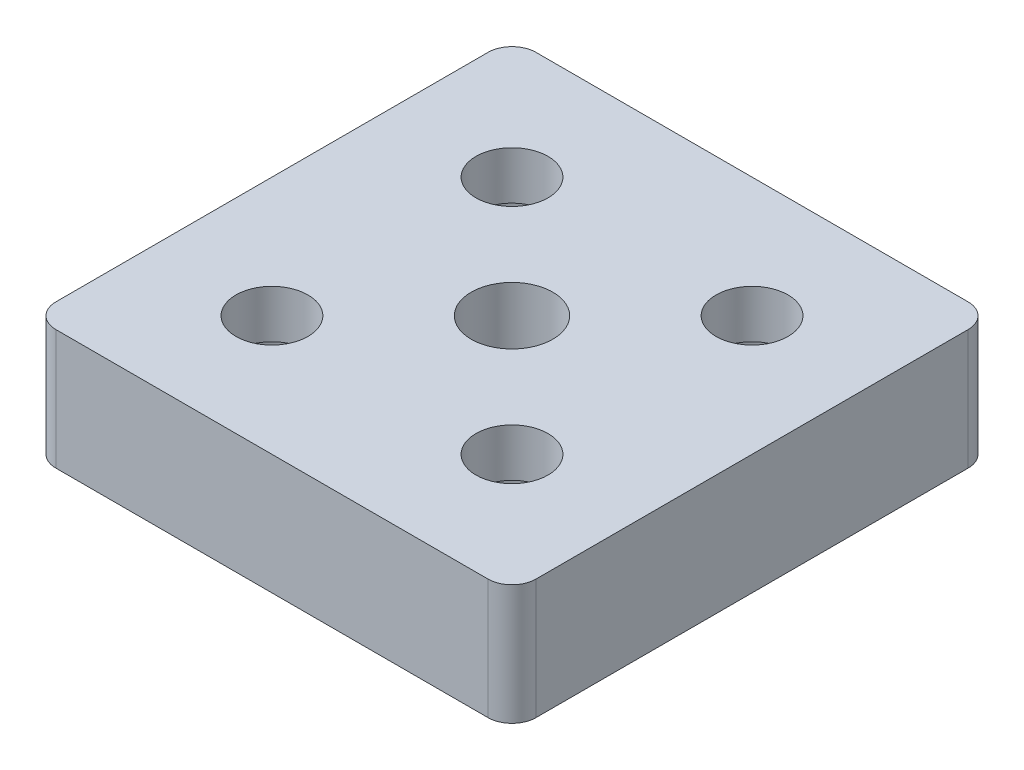
ISO-10303-21;
HEADER;
FILE_DESCRIPTION(('STEP AP214'),'2;1');
FILE_NAME('part.step','',(''),(''),'','','');
FILE_SCHEMA(('AUTOMOTIVE_DESIGN { 1 0 10303 214 1 1 1 1 }'));
ENDSEC;
DATA;
#1=APPLICATION_CONTEXT('core data for automotive mechanical design processes');
#2=APPLICATION_PROTOCOL_DEFINITION('international standard','automotive_design',2000,#1);
#3=PRODUCT_CONTEXT('',#1,'mechanical');
#4=PRODUCT('Part','Part','',(#3));
#5=PRODUCT_RELATED_PRODUCT_CATEGORY('part','',(#4));
#6=PRODUCT_DEFINITION_FORMATION('','',#4);
#7=PRODUCT_DEFINITION_CONTEXT('part definition',#1,'design');
#8=PRODUCT_DEFINITION('design','',#6,#7);
#9=PRODUCT_DEFINITION_SHAPE('','',#8);
#10=(LENGTH_UNIT() NAMED_UNIT(*) SI_UNIT(.MILLI.,.METRE.));
#11=(NAMED_UNIT(*) PLANE_ANGLE_UNIT() SI_UNIT($,.RADIAN.));
#12=(NAMED_UNIT(*) SI_UNIT($,.STERADIAN.) SOLID_ANGLE_UNIT());
#13=UNCERTAINTY_MEASURE_WITH_UNIT(LENGTH_MEASURE(1.E-05),#10,'distance_accuracy_value','');
#14=(GEOMETRIC_REPRESENTATION_CONTEXT(3) GLOBAL_UNCERTAINTY_ASSIGNED_CONTEXT((#13)) GLOBAL_UNIT_ASSIGNED_CONTEXT((#10,
#11,#12)) REPRESENTATION_CONTEXT('',''));
#15=CARTESIAN_POINT('',(0.,0.,0.));
#16=DIRECTION('',(0.,0.,1.));
#17=DIRECTION('',(1.,0.,0.));
#18=AXIS2_PLACEMENT_3D('',#15,#16,#17);
#19=CARTESIAN_POINT('',(10.,10.,-30.));
#20=DIRECTION('',(0.,-1.,0.));
#21=DIRECTION('',(0.,0.,-1.));
#22=AXIS2_PLACEMENT_3D('',#19,#20,#21);
#23=CYLINDRICAL_SURFACE('',#22,3.);
#24=CARTESIAN_POINT('',(10.,10.,-30.));
#25=DIRECTION('',(0.,1.,0.));
#26=DIRECTION('',(0.,0.,1.));
#27=AXIS2_PLACEMENT_3D('',#24,#25,#26);
#28=CIRCLE('',#27,3.);
#29=CARTESIAN_POINT('',(10.,10.,-27.));
#30=VERTEX_POINT('',#29);
#31=EDGE_CURVE('E141',#30,#30,#28,.T.);
#32=ORIENTED_EDGE('',*,*,#31,.T.);
#33=EDGE_LOOP('',(#32));
#34=FACE_BOUND('',#33,.T.);
#35=CARTESIAN_POINT('',(10.,6.,-30.));
#36=DIRECTION('',(0.,-1.,0.));
#37=DIRECTION('',(0.,0.,-1.));
#38=AXIS2_PLACEMENT_3D('',#35,#36,#37);
#39=CIRCLE('',#38,3.);
#40=CARTESIAN_POINT('',(10.,6.,-33.));
#41=VERTEX_POINT('',#40);
#42=EDGE_CURVE('E41',#41,#41,#39,.T.);
#43=ORIENTED_EDGE('',*,*,#42,.T.);
#44=EDGE_LOOP('',(#43));
#45=FACE_BOUND('',#44,.T.);
#46=ADVANCED_FACE('F37',(#34,#45),#23,.F.);
#47=CARTESIAN_POINT('',(-10.,10.,-30.));
#48=DIRECTION('',(0.,-1.,0.));
#49=DIRECTION('',(0.,0.,-1.));
#50=AXIS2_PLACEMENT_3D('',#47,#48,#49);
#51=CYLINDRICAL_SURFACE('',#50,3.);
#52=CARTESIAN_POINT('',(-10.,10.,-30.));
#53=DIRECTION('',(0.,1.,0.));
#54=DIRECTION('',(0.,0.,1.));
#55=AXIS2_PLACEMENT_3D('',#52,#53,#54);
#56=CIRCLE('',#55,3.);
#57=CARTESIAN_POINT('',(-10.,10.,-27.));
#58=VERTEX_POINT('',#57);
#59=EDGE_CURVE('E203',#58,#58,#56,.T.);
#60=ORIENTED_EDGE('',*,*,#59,.T.);
#61=EDGE_LOOP('',(#60));
#62=FACE_BOUND('',#61,.T.);
#63=CARTESIAN_POINT('',(-10.,6.,-30.));
#64=DIRECTION('',(0.,-1.,0.));
#65=DIRECTION('',(0.,0.,-1.));
#66=AXIS2_PLACEMENT_3D('',#63,#64,#65);
#67=CIRCLE('',#66,3.);
#68=CARTESIAN_POINT('',(-10.,6.,-33.));
#69=VERTEX_POINT('',#68);
#70=EDGE_CURVE('E173',#69,#69,#67,.T.);
#71=ORIENTED_EDGE('',*,*,#70,.T.);
#72=EDGE_LOOP('',(#71));
#73=FACE_BOUND('',#72,.T.);
#74=ADVANCED_FACE('F244',(#62,#73),#51,.F.);
#75=CARTESIAN_POINT('',(10.,10.,-9.99999999999977));
#76=DIRECTION('',(0.,-1.,0.));
#77=DIRECTION('',(0.,0.,-1.));
#78=AXIS2_PLACEMENT_3D('',#75,#76,#77);
#79=CYLINDRICAL_SURFACE('',#78,3.);
#80=CARTESIAN_POINT('',(10.,10.,-9.99999999999977));
#81=DIRECTION('',(0.,1.,0.));
#82=DIRECTION('',(0.,0.,1.));
#83=AXIS2_PLACEMENT_3D('',#80,#81,#82);
#84=CIRCLE('',#83,3.);
#85=CARTESIAN_POINT('',(10.,10.,-6.99999999999977));
#86=VERTEX_POINT('',#85);
#87=EDGE_CURVE('E167',#86,#86,#84,.T.);
#88=ORIENTED_EDGE('',*,*,#87,.T.);
#89=EDGE_LOOP('',(#88));
#90=FACE_BOUND('',#89,.T.);
#91=CARTESIAN_POINT('',(10.,6.,-9.99999999999977));
#92=DIRECTION('',(0.,-1.,0.));
#93=DIRECTION('',(0.,0.,-1.));
#94=AXIS2_PLACEMENT_3D('',#91,#92,#93);
#95=CIRCLE('',#94,3.);
#96=CARTESIAN_POINT('',(10.,6.,-12.9999999999998));
#97=VERTEX_POINT('',#96);
#98=EDGE_CURVE('E169',#97,#97,#95,.T.);
#99=ORIENTED_EDGE('',*,*,#98,.T.);
#100=EDGE_LOOP('',(#99));
#101=FACE_BOUND('',#100,.T.);
#102=ADVANCED_FACE('F250',(#90,#101),#79,.F.);
#103=CARTESIAN_POINT('',(-10.0000000000002,10.,-10.));
#104=DIRECTION('',(0.,-1.,0.));
#105=DIRECTION('',(0.,0.,-1.));
#106=AXIS2_PLACEMENT_3D('',#103,#104,#105);
#107=CYLINDRICAL_SURFACE('',#106,3.);
#108=CARTESIAN_POINT('',(-10.0000000000002,10.,-10.));
#109=DIRECTION('',(0.,1.,0.));
#110=DIRECTION('',(0.,0.,1.));
#111=AXIS2_PLACEMENT_3D('',#108,#109,#110);
#112=CIRCLE('',#111,3.);
#113=CARTESIAN_POINT('',(-10.0000000000002,10.,-7.));
#114=VERTEX_POINT('',#113);
#115=EDGE_CURVE('E200',#114,#114,#112,.T.);
#116=ORIENTED_EDGE('',*,*,#115,.T.);
#117=EDGE_LOOP('',(#116));
#118=FACE_BOUND('',#117,.T.);
#119=CARTESIAN_POINT('',(-10.0000000000002,6.,-10.));
#120=DIRECTION('',(0.,-1.,0.));
#121=DIRECTION('',(0.,0.,-1.));
#122=AXIS2_PLACEMENT_3D('',#119,#120,#121);
#123=CIRCLE('',#122,3.);
#124=CARTESIAN_POINT('',(-10.0000000000002,6.,-13.));
#125=VERTEX_POINT('',#124);
#126=EDGE_CURVE('E164',#125,#125,#123,.T.);
#127=ORIENTED_EDGE('',*,*,#126,.T.);
#128=EDGE_LOOP('',(#127));
#129=FACE_BOUND('',#128,.T.);
#130=ADVANCED_FACE('F257',(#118,#129),#107,.F.);
#131=CARTESIAN_POINT('',(-18.,10.,-2.));
#132=DIRECTION('',(0.,1.,0.));
#133=DIRECTION('',(0.,0.,1.));
#134=AXIS2_PLACEMENT_3D('',#131,#132,#133);
#135=PLANE('',#134);
#136=CARTESIAN_POINT('',(0.,10.,-20.));
#137=DIRECTION('',(0.,1.,0.));
#138=DIRECTION('',(0.,0.,1.));
#139=AXIS2_PLACEMENT_3D('',#136,#137,#138);
#140=CIRCLE('',#139,3.4);
#141=CARTESIAN_POINT('',(0.,10.,-16.6));
#142=VERTEX_POINT('',#141);
#143=EDGE_CURVE('E474',#142,#142,#140,.T.);
#144=ORIENTED_EDGE('',*,*,#143,.F.);
#145=EDGE_LOOP('',(#144));
#146=FACE_BOUND('',#145,.T.);
#147=ORIENTED_EDGE('',*,*,#115,.F.);
#148=EDGE_LOOP('',(#147));
#149=FACE_BOUND('',#148,.T.);
#150=ORIENTED_EDGE('',*,*,#31,.F.);
#151=EDGE_LOOP('',(#150));
#152=FACE_BOUND('',#151,.T.);
#153=CARTESIAN_POINT('',(-18.,10.,-2.));
#154=DIRECTION('',(0.,1.,0.));
#155=DIRECTION('',(0.,0.,1.));
#156=AXIS2_PLACEMENT_3D('',#153,#154,#155);
#157=CIRCLE('',#156,2.);
#158=CARTESIAN_POINT('',(-20.,10.,-2.));
#159=VERTEX_POINT('',#158);
#160=CARTESIAN_POINT('',(-18.,10.,0.));
#161=VERTEX_POINT('',#160);
#162=EDGE_CURVE('E152',#159,#161,#157,.T.);
#163=ORIENTED_EDGE('',*,*,#162,.T.);
#164=DIRECTION('',(1.,0.,0.));
#165=VECTOR('',#164,1.);
#166=CARTESIAN_POINT('',(-18.,10.,0.));
#167=LINE('',#166,#165);
#168=CARTESIAN_POINT('',(18.,10.,0.));
#169=VERTEX_POINT('',#168);
#170=EDGE_CURVE('E99',#161,#169,#167,.T.);
#171=ORIENTED_EDGE('',*,*,#170,.T.);
#172=CARTESIAN_POINT('',(18.,10.,-1.99999999999994));
#173=DIRECTION('',(0.,1.,0.));
#174=DIRECTION('',(0.,0.,1.));
#175=AXIS2_PLACEMENT_3D('',#172,#173,#174);
#176=CIRCLE('',#175,2.);
#177=CARTESIAN_POINT('',(20.,10.,-1.99999999999994));
#178=VERTEX_POINT('',#177);
#179=EDGE_CURVE('E210',#169,#178,#176,.T.);
#180=ORIENTED_EDGE('',*,*,#179,.T.);
#181=DIRECTION('',(0.,0.,-1.));
#182=VECTOR('',#181,1.);
#183=CARTESIAN_POINT('',(20.,10.,-1.99999999999994));
#184=LINE('',#183,#182);
#185=CARTESIAN_POINT('',(20.0000000000002,10.,-38.));
#186=VERTEX_POINT('',#185);
#187=EDGE_CURVE('E212',#178,#186,#184,.T.);
#188=ORIENTED_EDGE('',*,*,#187,.T.);
#189=CARTESIAN_POINT('',(18.0000000000002,10.,-38.));
#190=DIRECTION('',(0.,1.,0.));
#191=DIRECTION('',(0.,0.,1.));
#192=AXIS2_PLACEMENT_3D('',#189,#190,#191);
#193=CIRCLE('',#192,2.);
#194=CARTESIAN_POINT('',(18.0000000000002,10.,-40.));
#195=VERTEX_POINT('',#194);
#196=EDGE_CURVE('E119',#186,#195,#193,.T.);
#197=ORIENTED_EDGE('',*,*,#196,.T.);
#198=DIRECTION('',(-1.,0.,0.));
#199=VECTOR('',#198,1.);
#200=CARTESIAN_POINT('',(18.0000000000002,10.,-40.));
#201=LINE('',#200,#199);
#202=CARTESIAN_POINT('',(-18.,10.,-39.9999999999999));
#203=VERTEX_POINT('',#202);
#204=EDGE_CURVE('E112',#195,#203,#201,.T.);
#205=ORIENTED_EDGE('',*,*,#204,.T.);
#206=CARTESIAN_POINT('',(-18.,10.,-37.9999999999999));
#207=DIRECTION('',(0.,1.,0.));
#208=DIRECTION('',(0.,0.,1.));
#209=AXIS2_PLACEMENT_3D('',#206,#207,#208);
#210=CIRCLE('',#209,2.);
#211=CARTESIAN_POINT('',(-20.,10.,-37.9999999999999));
#212=VERTEX_POINT('',#211);
#213=EDGE_CURVE('E117',#203,#212,#210,.T.);
#214=ORIENTED_EDGE('',*,*,#213,.T.);
#215=DIRECTION('',(0.,0.,1.));
#216=VECTOR('',#215,1.);
#217=CARTESIAN_POINT('',(-20.,10.,-37.9999999999999));
#218=LINE('',#217,#216);
#219=EDGE_CURVE('E56',#212,#159,#218,.T.);
#220=ORIENTED_EDGE('',*,*,#219,.T.);
#221=EDGE_LOOP('',(#163,#171,#180,#188,#197,#205,#214,#220));
#222=FACE_BOUND('',#221,.T.);
#223=ORIENTED_EDGE('',*,*,#59,.F.);
#224=EDGE_LOOP('',(#223));
#225=FACE_BOUND('',#224,.T.);
#226=ORIENTED_EDGE('',*,*,#87,.F.);
#227=EDGE_LOOP('',(#226));
#228=FACE_BOUND('',#227,.T.);
#229=ADVANCED_FACE('F114',(#146,#149,#152,#222,#225,#228),#135,.T.);
#230=CARTESIAN_POINT('',(-18.,0.,-2.));
#231=DIRECTION('',(0.,1.,0.));
#232=DIRECTION('',(0.,0.,1.));
#233=AXIS2_PLACEMENT_3D('',#230,#231,#232);
#234=PLANE('',#233);
#235=CARTESIAN_POINT('',(0.,0.,-20.));
#236=DIRECTION('',(0.,1.,0.));
#237=DIRECTION('',(0.,0.,1.));
#238=AXIS2_PLACEMENT_3D('',#235,#236,#237);
#239=CIRCLE('',#238,3.39999999999999);
#240=CARTESIAN_POINT('',(0.,0.,-16.6));
#241=VERTEX_POINT('',#240);
#242=EDGE_CURVE('E268',#241,#241,#239,.T.);
#243=ORIENTED_EDGE('',*,*,#242,.T.);
#244=EDGE_LOOP('',(#243));
#245=FACE_BOUND('',#244,.T.);
#246=CARTESIAN_POINT('',(10.,0.,-30.));
#247=DIRECTION('',(0.,-1.,0.));
#248=DIRECTION('',(0.,0.,-1.));
#249=AXIS2_PLACEMENT_3D('',#246,#247,#248);
#250=CIRCLE('',#249,5.5);
#251=CARTESIAN_POINT('',(10.,0.,-35.5));
#252=VERTEX_POINT('',#251);
#253=EDGE_CURVE('E189',#252,#252,#250,.T.);
#254=ORIENTED_EDGE('',*,*,#253,.F.);
#255=EDGE_LOOP('',(#254));
#256=FACE_BOUND('',#255,.T.);
#257=CARTESIAN_POINT('',(-10.0000000000002,0.,-30.0000000000002));
#258=DIRECTION('',(0.,-1.,0.));
#259=DIRECTION('',(0.,0.,-1.));
#260=AXIS2_PLACEMENT_3D('',#257,#258,#259);
#261=CIRCLE('',#260,5.5);
#262=CARTESIAN_POINT('',(-10.0000000000002,0.,-35.5000000000002));
#263=VERTEX_POINT('',#262);
#264=EDGE_CURVE('E182',#263,#263,#261,.T.);
#265=ORIENTED_EDGE('',*,*,#264,.F.);
#266=EDGE_LOOP('',(#265));
#267=FACE_BOUND('',#266,.T.);
#268=CARTESIAN_POINT('',(10.,0.,-9.99999999999977));
#269=DIRECTION('',(0.,-1.,0.));
#270=DIRECTION('',(0.,0.,-1.));
#271=AXIS2_PLACEMENT_3D('',#268,#269,#270);
#272=CIRCLE('',#271,5.5);
#273=CARTESIAN_POINT('',(10.,0.,-15.4999999999998));
#274=VERTEX_POINT('',#273);
#275=EDGE_CURVE('E175',#274,#274,#272,.T.);
#276=ORIENTED_EDGE('',*,*,#275,.F.);
#277=EDGE_LOOP('',(#276));
#278=FACE_BOUND('',#277,.T.);
#279=CARTESIAN_POINT('',(-10.0000000000002,0.,-10.));
#280=DIRECTION('',(0.,-1.,0.));
#281=DIRECTION('',(0.,0.,-1.));
#282=AXIS2_PLACEMENT_3D('',#279,#280,#281);
#283=CIRCLE('',#282,5.5);
#284=CARTESIAN_POINT('',(-10.0000000000002,0.,-15.5));
#285=VERTEX_POINT('',#284);
#286=EDGE_CURVE('E171',#285,#285,#283,.T.);
#287=ORIENTED_EDGE('',*,*,#286,.F.);
#288=EDGE_LOOP('',(#287));
#289=FACE_BOUND('',#288,.T.);
#290=CARTESIAN_POINT('',(-18.,0.,-2.));
#291=DIRECTION('',(0.,1.,0.));
#292=DIRECTION('',(0.,0.,1.));
#293=AXIS2_PLACEMENT_3D('',#290,#291,#292);
#294=CIRCLE('',#293,2.);
#295=CARTESIAN_POINT('',(-20.,0.,-2.));
#296=VERTEX_POINT('',#295);
#297=CARTESIAN_POINT('',(-18.,0.,0.));
#298=VERTEX_POINT('',#297);
#299=EDGE_CURVE('E137',#296,#298,#294,.T.);
#300=ORIENTED_EDGE('',*,*,#299,.F.);
#301=DIRECTION('',(0.,0.,1.));
#302=VECTOR('',#301,1.);
#303=CARTESIAN_POINT('',(-20.,0.,-37.9999999999999));
#304=LINE('',#303,#302);
#305=CARTESIAN_POINT('',(-20.,0.,-37.9999999999999));
#306=VERTEX_POINT('',#305);
#307=EDGE_CURVE('E91',#306,#296,#304,.T.);
#308=ORIENTED_EDGE('',*,*,#307,.F.);
#309=CARTESIAN_POINT('',(-18.,0.,-37.9999999999999));
#310=DIRECTION('',(0.,1.,0.));
#311=DIRECTION('',(0.,0.,1.));
#312=AXIS2_PLACEMENT_3D('',#309,#310,#311);
#313=CIRCLE('',#312,2.);
#314=CARTESIAN_POINT('',(-18.,0.,-39.9999999999999));
#315=VERTEX_POINT('',#314);
#316=EDGE_CURVE('E85',#315,#306,#313,.T.);
#317=ORIENTED_EDGE('',*,*,#316,.F.);
#318=DIRECTION('',(-1.,0.,0.));
#319=VECTOR('',#318,1.);
#320=CARTESIAN_POINT('',(18.0000000000002,0.,-40.));
#321=LINE('',#320,#319);
#322=CARTESIAN_POINT('',(18.0000000000002,0.,-40.));
#323=VERTEX_POINT('',#322);
#324=EDGE_CURVE('E127',#323,#315,#321,.T.);
#325=ORIENTED_EDGE('',*,*,#324,.F.);
#326=CARTESIAN_POINT('',(18.0000000000002,0.,-38.));
#327=DIRECTION('',(0.,1.,0.));
#328=DIRECTION('',(0.,0.,1.));
#329=AXIS2_PLACEMENT_3D('',#326,#327,#328);
#330=CIRCLE('',#329,2.);
#331=CARTESIAN_POINT('',(20.0000000000002,0.,-38.));
#332=VERTEX_POINT('',#331);
#333=EDGE_CURVE('E147',#332,#323,#330,.T.);
#334=ORIENTED_EDGE('',*,*,#333,.F.);
#335=DIRECTION('',(0.,0.,-1.));
#336=VECTOR('',#335,1.);
#337=CARTESIAN_POINT('',(20.,0.,-1.99999999999994));
#338=LINE('',#337,#336);
#339=CARTESIAN_POINT('',(20.,0.,-1.99999999999994));
#340=VERTEX_POINT('',#339);
#341=EDGE_CURVE('E145',#340,#332,#338,.T.);
#342=ORIENTED_EDGE('',*,*,#341,.F.);
#343=CARTESIAN_POINT('',(18.,0.,-1.99999999999994));
#344=DIRECTION('',(0.,1.,0.));
#345=DIRECTION('',(0.,0.,1.));
#346=AXIS2_PLACEMENT_3D('',#343,#344,#345);
#347=CIRCLE('',#346,2.);
#348=CARTESIAN_POINT('',(18.,0.,0.));
#349=VERTEX_POINT('',#348);
#350=EDGE_CURVE('E143',#349,#340,#347,.T.);
#351=ORIENTED_EDGE('',*,*,#350,.F.);
#352=DIRECTION('',(1.,0.,0.));
#353=VECTOR('',#352,1.);
#354=CARTESIAN_POINT('',(-18.,0.,0.));
#355=LINE('',#354,#353);
#356=EDGE_CURVE('E140',#298,#349,#355,.T.);
#357=ORIENTED_EDGE('',*,*,#356,.F.);
#358=EDGE_LOOP('',(#300,#308,#317,#325,#334,#342,#351,#357));
#359=FACE_BOUND('',#358,.T.);
#360=ADVANCED_FACE('F225',(#245,#256,#267,#278,#289,#359),#234,.F.);
#361=CARTESIAN_POINT('',(-18.,10.,-2.));
#362=DIRECTION('',(0.,-1.,0.));
#363=DIRECTION('',(0.,0.,-1.));
#364=AXIS2_PLACEMENT_3D('',#361,#362,#363);
#365=CYLINDRICAL_SURFACE('',#364,2.);
#366=ORIENTED_EDGE('',*,*,#299,.T.);
#367=DIRECTION('',(0.,-1.,0.));
#368=VECTOR('',#367,1.);
#369=CARTESIAN_POINT('',(-18.,10.,0.));
#370=LINE('',#369,#368);
#371=EDGE_CURVE('E11',#161,#298,#370,.T.);
#372=ORIENTED_EDGE('',*,*,#371,.F.);
#373=ORIENTED_EDGE('',*,*,#162,.F.);
#374=DIRECTION('',(0.,-1.,0.));
#375=VECTOR('',#374,1.);
#376=CARTESIAN_POINT('',(-20.,10.,-2.));
#377=LINE('',#376,#375);
#378=EDGE_CURVE('E133',#159,#296,#377,.T.);
#379=ORIENTED_EDGE('',*,*,#378,.T.);
#380=EDGE_LOOP('',(#366,#372,#373,#379));
#381=FACE_BOUND('',#380,.T.);
#382=ADVANCED_FACE('F39',(#381),#365,.T.);
#383=CARTESIAN_POINT('',(-18.,10.,0.));
#384=DIRECTION('',(0.,0.,-1.));
#385=DIRECTION('',(-1.,0.,0.));
#386=AXIS2_PLACEMENT_3D('',#383,#384,#385);
#387=PLANE('',#386);
#388=ORIENTED_EDGE('',*,*,#356,.T.);
#389=DIRECTION('',(0.,-1.,0.));
#390=VECTOR('',#389,1.);
#391=CARTESIAN_POINT('',(18.,10.,0.));
#392=LINE('',#391,#390);
#393=EDGE_CURVE('E47',#169,#349,#392,.T.);
#394=ORIENTED_EDGE('',*,*,#393,.F.);
#395=ORIENTED_EDGE('',*,*,#170,.F.);
#396=ORIENTED_EDGE('',*,*,#371,.T.);
#397=EDGE_LOOP('',(#388,#394,#395,#396));
#398=FACE_BOUND('',#397,.T.);
#399=ADVANCED_FACE('F264',(#398),#387,.F.);
#400=CARTESIAN_POINT('',(18.,10.,-1.99999999999994));
#401=DIRECTION('',(0.,-1.,0.));
#402=DIRECTION('',(0.,0.,-1.));
#403=AXIS2_PLACEMENT_3D('',#400,#401,#402);
#404=CYLINDRICAL_SURFACE('',#403,2.);
#405=ORIENTED_EDGE('',*,*,#350,.T.);
#406=DIRECTION('',(0.,-1.,0.));
#407=VECTOR('',#406,1.);
#408=CARTESIAN_POINT('',(20.,10.,-1.99999999999994));
#409=LINE('',#408,#407);
#410=EDGE_CURVE('E159',#178,#340,#409,.T.);
#411=ORIENTED_EDGE('',*,*,#410,.F.);
#412=ORIENTED_EDGE('',*,*,#179,.F.);
#413=ORIENTED_EDGE('',*,*,#393,.T.);
#414=EDGE_LOOP('',(#405,#411,#412,#413));
#415=FACE_BOUND('',#414,.T.);
#416=ADVANCED_FACE('F433',(#415),#404,.T.);
#417=CARTESIAN_POINT('',(20.,10.,-1.99999999999994));
#418=DIRECTION('',(-1.,0.,0.));
#419=DIRECTION('',(0.,0.,1.));
#420=AXIS2_PLACEMENT_3D('',#417,#418,#419);
#421=PLANE('',#420);
#422=ORIENTED_EDGE('',*,*,#341,.T.);
#423=DIRECTION('',(0.,-1.,0.));
#424=VECTOR('',#423,1.);
#425=CARTESIAN_POINT('',(20.0000000000002,10.,-38.));
#426=LINE('',#425,#424);
#427=EDGE_CURVE('E156',#186,#332,#426,.T.);
#428=ORIENTED_EDGE('',*,*,#427,.F.);
#429=ORIENTED_EDGE('',*,*,#187,.F.);
#430=ORIENTED_EDGE('',*,*,#410,.T.);
#431=EDGE_LOOP('',(#422,#428,#429,#430));
#432=FACE_BOUND('',#431,.T.);
#433=ADVANCED_FACE('F218',(#432),#421,.F.);
#434=CARTESIAN_POINT('',(18.0000000000002,10.,-38.));
#435=DIRECTION('',(0.,-1.,0.));
#436=DIRECTION('',(0.,0.,-1.));
#437=AXIS2_PLACEMENT_3D('',#434,#435,#436);
#438=CYLINDRICAL_SURFACE('',#437,2.);
#439=ORIENTED_EDGE('',*,*,#333,.T.);
#440=DIRECTION('',(0.,-1.,0.));
#441=VECTOR('',#440,1.);
#442=CARTESIAN_POINT('',(18.0000000000002,10.,-40.));
#443=LINE('',#442,#441);
#444=EDGE_CURVE('E128',#195,#323,#443,.T.);
#445=ORIENTED_EDGE('',*,*,#444,.F.);
#446=ORIENTED_EDGE('',*,*,#196,.F.);
#447=ORIENTED_EDGE('',*,*,#427,.T.);
#448=EDGE_LOOP('',(#439,#445,#446,#447));
#449=FACE_BOUND('',#448,.T.);
#450=ADVANCED_FACE('F222',(#449),#438,.T.);
#451=CARTESIAN_POINT('',(18.0000000000002,10.,-40.));
#452=DIRECTION('',(0.,0.,1.));
#453=DIRECTION('',(1.,0.,0.));
#454=AXIS2_PLACEMENT_3D('',#451,#452,#453);
#455=PLANE('',#454);
#456=ORIENTED_EDGE('',*,*,#324,.T.);
#457=DIRECTION('',(0.,-1.,0.));
#458=VECTOR('',#457,1.);
#459=CARTESIAN_POINT('',(-18.,10.,-39.9999999999999));
#460=LINE('',#459,#458);
#461=EDGE_CURVE('E124',#203,#315,#460,.T.);
#462=ORIENTED_EDGE('',*,*,#461,.F.);
#463=ORIENTED_EDGE('',*,*,#204,.F.);
#464=ORIENTED_EDGE('',*,*,#444,.T.);
#465=EDGE_LOOP('',(#456,#462,#463,#464));
#466=FACE_BOUND('',#465,.T.);
#467=ADVANCED_FACE('F125',(#466),#455,.F.);
#468=CARTESIAN_POINT('',(-18.,10.,-37.9999999999999));
#469=DIRECTION('',(0.,-1.,0.));
#470=DIRECTION('',(0.,0.,-1.));
#471=AXIS2_PLACEMENT_3D('',#468,#469,#470);
#472=CYLINDRICAL_SURFACE('',#471,2.);
#473=ORIENTED_EDGE('',*,*,#316,.T.);
#474=DIRECTION('',(0.,-1.,0.));
#475=VECTOR('',#474,1.);
#476=CARTESIAN_POINT('',(-20.,10.,-37.9999999999999));
#477=LINE('',#476,#475);
#478=EDGE_CURVE('E129',#212,#306,#477,.T.);
#479=ORIENTED_EDGE('',*,*,#478,.F.);
#480=ORIENTED_EDGE('',*,*,#213,.F.);
#481=ORIENTED_EDGE('',*,*,#461,.T.);
#482=EDGE_LOOP('',(#473,#479,#480,#481));
#483=FACE_BOUND('',#482,.T.);
#484=ADVANCED_FACE('F131',(#483),#472,.T.);
#485=CARTESIAN_POINT('',(-20.,10.,-37.9999999999999));
#486=DIRECTION('',(1.,0.,0.));
#487=DIRECTION('',(0.,0.,-1.));
#488=AXIS2_PLACEMENT_3D('',#485,#486,#487);
#489=PLANE('',#488);
#490=ORIENTED_EDGE('',*,*,#307,.T.);
#491=ORIENTED_EDGE('',*,*,#378,.F.);
#492=ORIENTED_EDGE('',*,*,#219,.F.);
#493=ORIENTED_EDGE('',*,*,#478,.T.);
#494=EDGE_LOOP('',(#490,#491,#492,#493));
#495=FACE_BOUND('',#494,.T.);
#496=ADVANCED_FACE('F230',(#495),#489,.F.);
#497=CARTESIAN_POINT('',(-10.0000000000002,6.,-10.));
#498=DIRECTION('',(0.,-1.,0.));
#499=DIRECTION('',(0.,0.,-1.));
#500=AXIS2_PLACEMENT_3D('',#497,#498,#499);
#501=CYLINDRICAL_SURFACE('',#500,5.5);
#502=CARTESIAN_POINT('',(-10.0000000000002,6.,-10.));
#503=DIRECTION('',(0.,-1.,0.));
#504=DIRECTION('',(0.,0.,-1.));
#505=AXIS2_PLACEMENT_3D('',#502,#503,#504);
#506=CIRCLE('',#505,5.5);
#507=CARTESIAN_POINT('',(-10.0000000000002,6.,-15.5));
#508=VERTEX_POINT('',#507);
#509=EDGE_CURVE('E168',#508,#508,#506,.T.);
#510=ORIENTED_EDGE('',*,*,#509,.F.);
#511=EDGE_LOOP('',(#510));
#512=FACE_BOUND('',#511,.T.);
#513=ORIENTED_EDGE('',*,*,#286,.T.);
#514=EDGE_LOOP('',(#513));
#515=FACE_BOUND('',#514,.T.);
#516=ADVANCED_FACE('F232',(#512,#515),#501,.F.);
#517=CARTESIAN_POINT('',(-10.0000000000002,6.,-10.));
#518=DIRECTION('',(0.,-1.,0.));
#519=DIRECTION('',(0.,0.,-1.));
#520=AXIS2_PLACEMENT_3D('',#517,#518,#519);
#521=PLANE('',#520);
#522=ORIENTED_EDGE('',*,*,#126,.F.);
#523=EDGE_LOOP('',(#522));
#524=FACE_BOUND('',#523,.T.);
#525=ORIENTED_EDGE('',*,*,#509,.T.);
#526=EDGE_LOOP('',(#525));
#527=FACE_BOUND('',#526,.T.);
#528=ADVANCED_FACE('F238',(#524,#527),#521,.T.);
#529=CARTESIAN_POINT('',(10.,6.,-9.99999999999977));
#530=DIRECTION('',(0.,-1.,0.));
#531=DIRECTION('',(0.,0.,-1.));
#532=AXIS2_PLACEMENT_3D('',#529,#530,#531);
#533=CYLINDRICAL_SURFACE('',#532,5.5);
#534=CARTESIAN_POINT('',(10.,6.,-9.99999999999977));
#535=DIRECTION('',(0.,-1.,0.));
#536=DIRECTION('',(0.,0.,-1.));
#537=AXIS2_PLACEMENT_3D('',#534,#535,#536);
#538=CIRCLE('',#537,5.5);
#539=CARTESIAN_POINT('',(10.,6.,-15.4999999999998));
#540=VERTEX_POINT('',#539);
#541=EDGE_CURVE('E172',#540,#540,#538,.T.);
#542=ORIENTED_EDGE('',*,*,#541,.F.);
#543=EDGE_LOOP('',(#542));
#544=FACE_BOUND('',#543,.T.);
#545=ORIENTED_EDGE('',*,*,#275,.T.);
#546=EDGE_LOOP('',(#545));
#547=FACE_BOUND('',#546,.T.);
#548=ADVANCED_FACE('F279',(#544,#547),#533,.F.);
#549=CARTESIAN_POINT('',(10.,6.,-9.99999999999977));
#550=DIRECTION('',(0.,-1.,0.));
#551=DIRECTION('',(0.,0.,-1.));
#552=AXIS2_PLACEMENT_3D('',#549,#550,#551);
#553=PLANE('',#552);
#554=ORIENTED_EDGE('',*,*,#98,.F.);
#555=EDGE_LOOP('',(#554));
#556=FACE_BOUND('',#555,.T.);
#557=ORIENTED_EDGE('',*,*,#541,.T.);
#558=EDGE_LOOP('',(#557));
#559=FACE_BOUND('',#558,.T.);
#560=ADVANCED_FACE('F281',(#556,#559),#553,.T.);
#561=CARTESIAN_POINT('',(-10.0000000000002,6.,-30.0000000000002));
#562=DIRECTION('',(0.,-1.,0.));
#563=DIRECTION('',(0.,0.,-1.));
#564=AXIS2_PLACEMENT_3D('',#561,#562,#563);
#565=CYLINDRICAL_SURFACE('',#564,5.5);
#566=CARTESIAN_POINT('',(-10.0000000000002,6.,-30.0000000000002));
#567=DIRECTION('',(0.,-1.,0.));
#568=DIRECTION('',(0.,0.,-1.));
#569=AXIS2_PLACEMENT_3D('',#566,#567,#568);
#570=CIRCLE('',#569,5.5);
#571=CARTESIAN_POINT('',(-10.0000000000002,6.,-35.5000000000002));
#572=VERTEX_POINT('',#571);
#573=EDGE_CURVE('E176',#572,#572,#570,.T.);
#574=ORIENTED_EDGE('',*,*,#573,.F.);
#575=EDGE_LOOP('',(#574));
#576=FACE_BOUND('',#575,.T.);
#577=ORIENTED_EDGE('',*,*,#264,.T.);
#578=EDGE_LOOP('',(#577));
#579=FACE_BOUND('',#578,.T.);
#580=ADVANCED_FACE('F288',(#576,#579),#565,.F.);
#581=CARTESIAN_POINT('',(-10.0000000000002,6.,-30.0000000000002));
#582=DIRECTION('',(0.,-1.,0.));
#583=DIRECTION('',(0.,0.,-1.));
#584=AXIS2_PLACEMENT_3D('',#581,#582,#583);
#585=PLANE('',#584);
#586=ORIENTED_EDGE('',*,*,#70,.F.);
#587=EDGE_LOOP('',(#586));
#588=FACE_BOUND('',#587,.T.);
#589=ORIENTED_EDGE('',*,*,#573,.T.);
#590=EDGE_LOOP('',(#589));
#591=FACE_BOUND('',#590,.T.);
#592=ADVANCED_FACE('F351',(#588,#591),#585,.T.);
#593=CARTESIAN_POINT('',(10.,6.,-30.));
#594=DIRECTION('',(0.,-1.,0.));
#595=DIRECTION('',(0.,0.,-1.));
#596=AXIS2_PLACEMENT_3D('',#593,#594,#595);
#597=CYLINDRICAL_SURFACE('',#596,5.5);
#598=CARTESIAN_POINT('',(10.,6.,-30.));
#599=DIRECTION('',(0.,-1.,0.));
#600=DIRECTION('',(0.,0.,-1.));
#601=AXIS2_PLACEMENT_3D('',#598,#599,#600);
#602=CIRCLE('',#601,5.5);
#603=CARTESIAN_POINT('',(10.,6.,-35.5));
#604=VERTEX_POINT('',#603);
#605=EDGE_CURVE('E473',#604,#604,#602,.T.);
#606=ORIENTED_EDGE('',*,*,#605,.F.);
#607=EDGE_LOOP('',(#606));
#608=FACE_BOUND('',#607,.T.);
#609=ORIENTED_EDGE('',*,*,#253,.T.);
#610=EDGE_LOOP('',(#609));
#611=FACE_BOUND('',#610,.T.);
#612=ADVANCED_FACE('F346',(#608,#611),#597,.F.);
#613=CARTESIAN_POINT('',(10.,6.,-30.));
#614=DIRECTION('',(0.,-1.,0.));
#615=DIRECTION('',(0.,0.,-1.));
#616=AXIS2_PLACEMENT_3D('',#613,#614,#615);
#617=PLANE('',#616);
#618=ORIENTED_EDGE('',*,*,#42,.F.);
#619=EDGE_LOOP('',(#618));
#620=FACE_BOUND('',#619,.T.);
#621=ORIENTED_EDGE('',*,*,#605,.T.);
#622=EDGE_LOOP('',(#621));
#623=FACE_BOUND('',#622,.T.);
#624=ADVANCED_FACE('F323',(#620,#623),#617,.T.);
#625=CARTESIAN_POINT('',(0.,10.,-20.));
#626=DIRECTION('',(0.,1.,0.));
#627=DIRECTION('',(0.,0.,1.));
#628=AXIS2_PLACEMENT_3D('',#625,#626,#627);
#629=CYLINDRICAL_SURFACE('',#628,3.39999999999999);
#630=ORIENTED_EDGE('',*,*,#143,.T.);
#631=EDGE_LOOP('',(#630));
#632=FACE_BOUND('',#631,.T.);
#633=ORIENTED_EDGE('',*,*,#242,.F.);
#634=EDGE_LOOP('',(#633));
#635=FACE_BOUND('',#634,.T.);
#636=ADVANCED_FACE('F333',(#632,#635),#629,.F.);
#637=CLOSED_SHELL('',(#46,#74,#102,#130,#229,#360,#382,#399,#416,#433,#450,#467,#484,#496,#516,
#528,#548,#560,#580,#592,#612,#624,#636));
#638=MANIFOLD_SOLID_BREP('B2',#637);
#639=ADVANCED_BREP_SHAPE_REPRESENTATION('',(#18,#638),#14);
#640=SHAPE_DEFINITION_REPRESENTATION(#9,#639);
ENDSEC;
END-ISO-10303-21;
